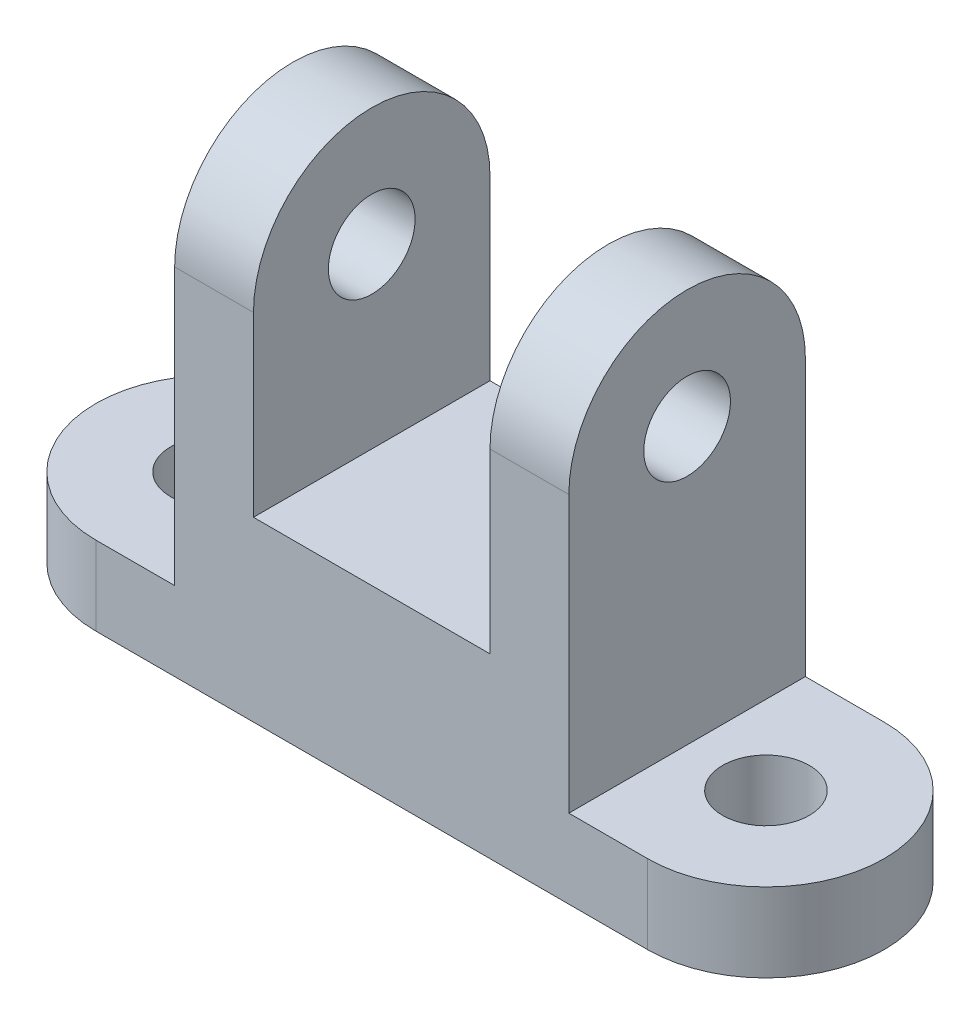
ISO-10303-21;
HEADER;
FILE_DESCRIPTION(('STEP AP214'),'2;1');
FILE_NAME('part.step','',(''),(''),'','','');
FILE_SCHEMA(('AUTOMOTIVE_DESIGN { 1 0 10303 214 1 1 1 1 }'));
ENDSEC;
DATA;
#1=APPLICATION_CONTEXT('core data for automotive mechanical design processes');
#2=APPLICATION_PROTOCOL_DEFINITION('international standard','automotive_design',2000,#1);
#3=PRODUCT_CONTEXT('',#1,'mechanical');
#4=PRODUCT('Part','Part','',(#3));
#5=PRODUCT_RELATED_PRODUCT_CATEGORY('part','',(#4));
#6=PRODUCT_DEFINITION_FORMATION('','',#4);
#7=PRODUCT_DEFINITION_CONTEXT('part definition',#1,'design');
#8=PRODUCT_DEFINITION('design','',#6,#7);
#9=PRODUCT_DEFINITION_SHAPE('','',#8);
#10=(LENGTH_UNIT() NAMED_UNIT(*) SI_UNIT(.MILLI.,.METRE.));
#11=(NAMED_UNIT(*) PLANE_ANGLE_UNIT() SI_UNIT($,.RADIAN.));
#12=(NAMED_UNIT(*) SI_UNIT($,.STERADIAN.) SOLID_ANGLE_UNIT());
#13=UNCERTAINTY_MEASURE_WITH_UNIT(LENGTH_MEASURE(1.E-05),#10,'distance_accuracy_value','');
#14=(GEOMETRIC_REPRESENTATION_CONTEXT(3) GLOBAL_UNCERTAINTY_ASSIGNED_CONTEXT((#13)) GLOBAL_UNIT_ASSIGNED_CONTEXT((#10,
#11,#12)) REPRESENTATION_CONTEXT('',''));
#15=CARTESIAN_POINT('',(0.,0.,0.));
#16=DIRECTION('',(0.,0.,1.));
#17=DIRECTION('',(1.,0.,0.));
#18=AXIS2_PLACEMENT_3D('',#15,#16,#17);
#19=CARTESIAN_POINT('',(-5.,9.,0.));
#20=DIRECTION('',(-1.,0.,0.));
#21=DIRECTION('',(0.,0.,1.));
#22=AXIS2_PLACEMENT_3D('',#19,#20,#21);
#23=CYLINDRICAL_SURFACE('',#22,3.);
#24=CARTESIAN_POINT('',(-3.,9.,0.));
#25=DIRECTION('',(-1.,0.,0.));
#26=DIRECTION('',(0.,-1.,0.));
#27=AXIS2_PLACEMENT_3D('',#24,#25,#26);
#28=CIRCLE('',#27,3.);
#29=CARTESIAN_POINT('',(-3.,9.,-3.));
#30=VERTEX_POINT('',#29);
#31=CARTESIAN_POINT('',(-3.,9.,3.));
#32=VERTEX_POINT('',#31);
#33=EDGE_CURVE('E161',#30,#32,#28,.F.);
#34=ORIENTED_EDGE('',*,*,#33,.F.);
#35=DIRECTION('',(-1.,0.,0.));
#36=VECTOR('',#35,1.);
#37=CARTESIAN_POINT('',(-7.,9.,-3.));
#38=LINE('',#37,#36);
#39=CARTESIAN_POINT('',(-5.,9.,-3.));
#40=VERTEX_POINT('',#39);
#41=EDGE_CURVE('E232',#40,#30,#38,.F.);
#42=ORIENTED_EDGE('',*,*,#41,.F.);
#43=CARTESIAN_POINT('',(-5.,9.,0.));
#44=DIRECTION('',(-1.,0.,0.));
#45=DIRECTION('',(0.,0.,1.));
#46=AXIS2_PLACEMENT_3D('',#43,#44,#45);
#47=CIRCLE('',#46,3.);
#48=CARTESIAN_POINT('',(-5.,9.,3.));
#49=VERTEX_POINT('',#48);
#50=EDGE_CURVE('E48',#49,#40,#47,.T.);
#51=ORIENTED_EDGE('',*,*,#50,.F.);
#52=DIRECTION('',(-1.,0.,0.));
#53=VECTOR('',#52,1.);
#54=CARTESIAN_POINT('',(-7.,9.,3.));
#55=LINE('',#54,#53);
#56=EDGE_CURVE('E64',#32,#49,#55,.T.);
#57=ORIENTED_EDGE('',*,*,#56,.F.);
#58=EDGE_LOOP('',(#34,#42,#51,#57));
#59=FACE_BOUND('',#58,.T.);
#60=ADVANCED_FACE('F38',(#59),#23,.T.);
#61=CARTESIAN_POINT('',(-23.,9.,0.));
#62=DIRECTION('',(1.,0.,0.));
#63=DIRECTION('',(0.,0.,-1.));
#64=AXIS2_PLACEMENT_3D('',#61,#62,#63);
#65=CYLINDRICAL_SURFACE('',#64,1.1);
#66=CARTESIAN_POINT('',(-3.,9.,0.));
#67=DIRECTION('',(-1.,0.,0.));
#68=DIRECTION('',(0.,-1.,0.));
#69=AXIS2_PLACEMENT_3D('',#66,#67,#68);
#70=CIRCLE('',#69,1.1);
#71=CARTESIAN_POINT('',(-3.,7.9,0.));
#72=VERTEX_POINT('',#71);
#73=EDGE_CURVE('E43',#72,#72,#70,.F.);
#74=ORIENTED_EDGE('',*,*,#73,.T.);
#75=EDGE_LOOP('',(#74));
#76=FACE_BOUND('',#75,.T.);
#77=CARTESIAN_POINT('',(-5.,9.,0.));
#78=DIRECTION('',(-1.,0.,0.));
#79=DIRECTION('',(0.,0.,1.));
#80=AXIS2_PLACEMENT_3D('',#77,#78,#79);
#81=CIRCLE('',#80,1.1);
#82=CARTESIAN_POINT('',(-5.,9.,1.1));
#83=VERTEX_POINT('',#82);
#84=EDGE_CURVE('E180',#83,#83,#81,.T.);
#85=ORIENTED_EDGE('',*,*,#84,.T.);
#86=EDGE_LOOP('',(#85));
#87=FACE_BOUND('',#86,.T.);
#88=ADVANCED_FACE('F258',(#76,#87),#65,.F.);
#89=CARTESIAN_POINT('',(3.,9.,0.));
#90=DIRECTION('',(1.,0.,0.));
#91=DIRECTION('',(0.,1.,0.));
#92=AXIS2_PLACEMENT_3D('',#89,#90,#91);
#93=CIRCLE('',#92,3.);
#94=CARTESIAN_POINT('',(3.,9.,3.));
#95=VERTEX_POINT('',#94);
#96=CARTESIAN_POINT('',(3.,9.,-3.));
#97=VERTEX_POINT('',#96);
#98=EDGE_CURVE('E56',#95,#97,#93,.F.);
#99=ORIENTED_EDGE('',*,*,#98,.F.);
#100=CARTESIAN_POINT('',(5.,9.,3.));
#101=VERTEX_POINT('',#100);
#102=EDGE_CURVE('E234',#101,#95,#55,.T.);
#103=ORIENTED_EDGE('',*,*,#102,.F.);
#104=CARTESIAN_POINT('',(5.,9.,0.));
#105=DIRECTION('',(-1.,0.,0.));
#106=DIRECTION('',(0.,0.,1.));
#107=AXIS2_PLACEMENT_3D('',#104,#105,#106);
#108=CIRCLE('',#107,3.);
#109=CARTESIAN_POINT('',(5.,9.,-3.));
#110=VERTEX_POINT('',#109);
#111=EDGE_CURVE('E11',#110,#101,#108,.F.);
#112=ORIENTED_EDGE('',*,*,#111,.F.);
#113=EDGE_CURVE('E231',#97,#110,#38,.F.);
#114=ORIENTED_EDGE('',*,*,#113,.F.);
#115=EDGE_LOOP('',(#99,#103,#112,#114));
#116=FACE_BOUND('',#115,.T.);
#117=ADVANCED_FACE('F41',(#116),#23,.T.);
#118=CARTESIAN_POINT('',(-7.,2.,0.));
#119=DIRECTION('',(0.,1.,0.));
#120=DIRECTION('',(0.,0.,1.));
#121=AXIS2_PLACEMENT_3D('',#118,#119,#120);
#122=PLANE('',#121);
#123=CARTESIAN_POINT('',(7.,2.,0.));
#124=DIRECTION('',(0.,1.,0.));
#125=DIRECTION('',(0.,0.,1.));
#126=AXIS2_PLACEMENT_3D('',#123,#124,#125);
#127=CIRCLE('',#126,1.1);
#128=CARTESIAN_POINT('',(7.,2.,1.1));
#129=VERTEX_POINT('',#128);
#130=EDGE_CURVE('E171',#129,#129,#127,.T.);
#131=ORIENTED_EDGE('',*,*,#130,.F.);
#132=EDGE_LOOP('',(#131));
#133=FACE_BOUND('',#132,.T.);
#134=DIRECTION('',(-1.,0.,0.));
#135=VECTOR('',#134,1.);
#136=CARTESIAN_POINT('',(-7.,2.,-3.));
#137=LINE('',#136,#135);
#138=CARTESIAN_POINT('',(7.,2.,-3.));
#139=VERTEX_POINT('',#138);
#140=CARTESIAN_POINT('',(5.,2.,-3.));
#141=VERTEX_POINT('',#140);
#142=EDGE_CURVE('E210',#139,#141,#137,.T.);
#143=ORIENTED_EDGE('',*,*,#142,.T.);
#144=DIRECTION('',(0.,0.,1.));
#145=VECTOR('',#144,1.);
#146=CARTESIAN_POINT('',(5.,2.,0.));
#147=LINE('',#146,#145);
#148=CARTESIAN_POINT('',(5.,2.,3.));
#149=VERTEX_POINT('',#148);
#150=EDGE_CURVE('E195',#141,#149,#147,.T.);
#151=ORIENTED_EDGE('',*,*,#150,.T.);
#152=DIRECTION('',(1.,0.,0.));
#153=VECTOR('',#152,1.);
#154=CARTESIAN_POINT('',(-7.,2.,3.));
#155=LINE('',#154,#153);
#156=CARTESIAN_POINT('',(7.,2.,3.));
#157=VERTEX_POINT('',#156);
#158=EDGE_CURVE('E202',#149,#157,#155,.T.);
#159=ORIENTED_EDGE('',*,*,#158,.T.);
#160=CARTESIAN_POINT('',(7.,2.,0.));
#161=DIRECTION('',(0.,1.,0.));
#162=DIRECTION('',(0.,0.,1.));
#163=AXIS2_PLACEMENT_3D('',#160,#161,#162);
#164=CIRCLE('',#163,3.);
#165=EDGE_CURVE('E207',#157,#139,#164,.T.);
#166=ORIENTED_EDGE('',*,*,#165,.T.);
#167=EDGE_LOOP('',(#143,#151,#159,#166));
#168=FACE_BOUND('',#167,.T.);
#169=ADVANCED_FACE('F267',(#133,#168),#122,.T.);
#170=CARTESIAN_POINT('',(-7.,2.,0.));
#171=DIRECTION('',(0.,-1.,0.));
#172=DIRECTION('',(0.,0.,-1.));
#173=AXIS2_PLACEMENT_3D('',#170,#171,#172);
#174=CYLINDRICAL_SURFACE('',#173,3.);
#175=CARTESIAN_POINT('',(-7.,0.,0.));
#176=DIRECTION('',(0.,1.,0.));
#177=DIRECTION('',(0.,0.,1.));
#178=AXIS2_PLACEMENT_3D('',#175,#176,#177);
#179=CIRCLE('',#178,3.);
#180=CARTESIAN_POINT('',(-7.,0.,-3.));
#181=VERTEX_POINT('',#180);
#182=CARTESIAN_POINT('',(-7.,0.,3.));
#183=VERTEX_POINT('',#182);
#184=EDGE_CURVE('E198',#181,#183,#179,.T.);
#185=ORIENTED_EDGE('',*,*,#184,.T.);
#186=DIRECTION('',(0.,-1.,0.));
#187=VECTOR('',#186,1.);
#188=CARTESIAN_POINT('',(-7.,2.,3.));
#189=LINE('',#188,#187);
#190=CARTESIAN_POINT('',(-7.,2.,3.));
#191=VERTEX_POINT('',#190);
#192=EDGE_CURVE('E228',#191,#183,#189,.T.);
#193=ORIENTED_EDGE('',*,*,#192,.F.);
#194=CARTESIAN_POINT('',(-7.,2.,0.));
#195=DIRECTION('',(0.,1.,0.));
#196=DIRECTION('',(0.,0.,1.));
#197=AXIS2_PLACEMENT_3D('',#194,#195,#196);
#198=CIRCLE('',#197,3.);
#199=CARTESIAN_POINT('',(-7.,2.,-3.));
#200=VERTEX_POINT('',#199);
#201=EDGE_CURVE('E199',#200,#191,#198,.T.);
#202=ORIENTED_EDGE('',*,*,#201,.F.);
#203=DIRECTION('',(0.,-1.,0.));
#204=VECTOR('',#203,1.);
#205=CARTESIAN_POINT('',(-7.,2.,-3.));
#206=LINE('',#205,#204);
#207=EDGE_CURVE('E212',#200,#181,#206,.T.);
#208=ORIENTED_EDGE('',*,*,#207,.T.);
#209=EDGE_LOOP('',(#185,#193,#202,#208));
#210=FACE_BOUND('',#209,.T.);
#211=ADVANCED_FACE('F272',(#210),#174,.T.);
#212=CARTESIAN_POINT('',(-7.,2.,3.));
#213=DIRECTION('',(0.,0.,-1.));
#214=DIRECTION('',(-1.,0.,0.));
#215=AXIS2_PLACEMENT_3D('',#212,#213,#214);
#216=PLANE('',#215);
#217=DIRECTION('',(-1.,0.,0.));
#218=VECTOR('',#217,1.);
#219=CARTESIAN_POINT('',(-7.,4.5,3.));
#220=LINE('',#219,#218);
#221=CARTESIAN_POINT('',(3.,4.5,3.));
#222=VERTEX_POINT('',#221);
#223=CARTESIAN_POINT('',(-3.,4.5,3.));
#224=VERTEX_POINT('',#223);
#225=EDGE_CURVE('E138',#222,#224,#220,.T.);
#226=ORIENTED_EDGE('',*,*,#225,.T.);
#227=DIRECTION('',(0.,1.,0.));
#228=VECTOR('',#227,1.);
#229=CARTESIAN_POINT('',(-3.,2.,3.));
#230=LINE('',#229,#228);
#231=EDGE_CURVE('E159',#224,#32,#230,.T.);
#232=ORIENTED_EDGE('',*,*,#231,.T.);
#233=ORIENTED_EDGE('',*,*,#56,.T.);
#234=DIRECTION('',(0.,-1.,0.));
#235=VECTOR('',#234,1.);
#236=CARTESIAN_POINT('',(-5.,0.,3.));
#237=LINE('',#236,#235);
#238=CARTESIAN_POINT('',(-5.,2.,3.));
#239=VERTEX_POINT('',#238);
#240=EDGE_CURVE('E189',#49,#239,#237,.T.);
#241=ORIENTED_EDGE('',*,*,#240,.T.);
#242=EDGE_CURVE('E204',#191,#239,#155,.T.);
#243=ORIENTED_EDGE('',*,*,#242,.F.);
#244=ORIENTED_EDGE('',*,*,#192,.T.);
#245=DIRECTION('',(1.,0.,0.));
#246=VECTOR('',#245,1.);
#247=CARTESIAN_POINT('',(-7.,0.,3.));
#248=LINE('',#247,#246);
#249=CARTESIAN_POINT('',(7.,0.,3.));
#250=VERTEX_POINT('',#249);
#251=EDGE_CURVE('E215',#183,#250,#248,.T.);
#252=ORIENTED_EDGE('',*,*,#251,.T.);
#253=DIRECTION('',(0.,-1.,0.));
#254=VECTOR('',#253,1.);
#255=CARTESIAN_POINT('',(7.,2.,3.));
#256=LINE('',#255,#254);
#257=EDGE_CURVE('E225',#157,#250,#256,.T.);
#258=ORIENTED_EDGE('',*,*,#257,.F.);
#259=ORIENTED_EDGE('',*,*,#158,.F.);
#260=DIRECTION('',(0.,-1.,0.));
#261=VECTOR('',#260,1.);
#262=CARTESIAN_POINT('',(5.,0.,3.));
#263=LINE('',#262,#261);
#264=EDGE_CURVE('E182',#101,#149,#263,.T.);
#265=ORIENTED_EDGE('',*,*,#264,.F.);
#266=ORIENTED_EDGE('',*,*,#102,.T.);
#267=DIRECTION('',(0.,-1.,0.));
#268=VECTOR('',#267,1.);
#269=CARTESIAN_POINT('',(3.,2.,3.));
#270=LINE('',#269,#268);
#271=EDGE_CURVE('E156',#95,#222,#270,.T.);
#272=ORIENTED_EDGE('',*,*,#271,.T.);
#273=EDGE_LOOP('',(#226,#232,#233,#241,#243,#244,#252,#258,#259,#265,#266,#272));
#274=FACE_BOUND('',#273,.T.);
#275=ADVANCED_FACE('F279',(#274),#216,.F.);
#276=CARTESIAN_POINT('',(7.,2.,0.));
#277=DIRECTION('',(0.,-1.,0.));
#278=DIRECTION('',(0.,0.,-1.));
#279=AXIS2_PLACEMENT_3D('',#276,#277,#278);
#280=CYLINDRICAL_SURFACE('',#279,3.);
#281=CARTESIAN_POINT('',(7.,0.,0.));
#282=DIRECTION('',(0.,1.,0.));
#283=DIRECTION('',(0.,0.,1.));
#284=AXIS2_PLACEMENT_3D('',#281,#282,#283);
#285=CIRCLE('',#284,3.);
#286=CARTESIAN_POINT('',(7.,0.,-3.));
#287=VERTEX_POINT('',#286);
#288=EDGE_CURVE('E217',#250,#287,#285,.T.);
#289=ORIENTED_EDGE('',*,*,#288,.T.);
#290=DIRECTION('',(0.,-1.,0.));
#291=VECTOR('',#290,1.);
#292=CARTESIAN_POINT('',(7.,2.,-3.));
#293=LINE('',#292,#291);
#294=EDGE_CURVE('E222',#139,#287,#293,.T.);
#295=ORIENTED_EDGE('',*,*,#294,.F.);
#296=ORIENTED_EDGE('',*,*,#165,.F.);
#297=ORIENTED_EDGE('',*,*,#257,.T.);
#298=EDGE_LOOP('',(#289,#295,#296,#297));
#299=FACE_BOUND('',#298,.T.);
#300=ADVANCED_FACE('F330',(#299),#280,.T.);
#301=CARTESIAN_POINT('',(-7.,2.,-3.));
#302=DIRECTION('',(0.,0.,1.));
#303=DIRECTION('',(1.,0.,0.));
#304=AXIS2_PLACEMENT_3D('',#301,#302,#303);
#305=PLANE('',#304);
#306=ORIENTED_EDGE('',*,*,#41,.T.);
#307=DIRECTION('',(0.,1.,0.));
#308=VECTOR('',#307,1.);
#309=CARTESIAN_POINT('',(-3.,13.7058288155448,-3.));
#310=LINE('',#309,#308);
#311=CARTESIAN_POINT('',(-3.,4.5,-3.));
#312=VERTEX_POINT('',#311);
#313=EDGE_CURVE('E147',#312,#30,#310,.T.);
#314=ORIENTED_EDGE('',*,*,#313,.F.);
#315=DIRECTION('',(-1.,0.,0.));
#316=VECTOR('',#315,1.);
#317=CARTESIAN_POINT('',(3.,4.5,-3.));
#318=LINE('',#317,#316);
#319=CARTESIAN_POINT('',(3.,4.5,-3.));
#320=VERTEX_POINT('',#319);
#321=EDGE_CURVE('E135',#320,#312,#318,.T.);
#322=ORIENTED_EDGE('',*,*,#321,.F.);
#323=DIRECTION('',(0.,-1.,0.));
#324=VECTOR('',#323,1.);
#325=CARTESIAN_POINT('',(3.,13.7058288155448,-3.));
#326=LINE('',#325,#324);
#327=EDGE_CURVE('E142',#97,#320,#326,.T.);
#328=ORIENTED_EDGE('',*,*,#327,.F.);
#329=ORIENTED_EDGE('',*,*,#113,.T.);
#330=DIRECTION('',(0.,1.,0.));
#331=VECTOR('',#330,1.);
#332=CARTESIAN_POINT('',(5.,0.,-3.));
#333=LINE('',#332,#331);
#334=EDGE_CURVE('E184',#141,#110,#333,.T.);
#335=ORIENTED_EDGE('',*,*,#334,.F.);
#336=ORIENTED_EDGE('',*,*,#142,.F.);
#337=ORIENTED_EDGE('',*,*,#294,.T.);
#338=DIRECTION('',(-1.,0.,0.));
#339=VECTOR('',#338,1.);
#340=CARTESIAN_POINT('',(-7.,0.,-3.));
#341=LINE('',#340,#339);
#342=EDGE_CURVE('E203',#287,#181,#341,.T.);
#343=ORIENTED_EDGE('',*,*,#342,.T.);
#344=ORIENTED_EDGE('',*,*,#207,.F.);
#345=CARTESIAN_POINT('',(-5.,2.,-3.));
#346=VERTEX_POINT('',#345);
#347=EDGE_CURVE('E209',#346,#200,#137,.T.);
#348=ORIENTED_EDGE('',*,*,#347,.F.);
#349=DIRECTION('',(0.,1.,0.));
#350=VECTOR('',#349,1.);
#351=CARTESIAN_POINT('',(-5.,0.,-3.));
#352=LINE('',#351,#350);
#353=EDGE_CURVE('E185',#346,#40,#352,.T.);
#354=ORIENTED_EDGE('',*,*,#353,.T.);
#355=EDGE_LOOP('',(#306,#314,#322,#328,#329,#335,#336,#337,#343,#344,#348,#354));
#356=FACE_BOUND('',#355,.T.);
#357=ADVANCED_FACE('F150',(#356),#305,.F.);
#358=CARTESIAN_POINT('',(-7.,2.,0.));
#359=DIRECTION('',(0.,1.,0.));
#360=DIRECTION('',(0.,0.,1.));
#361=AXIS2_PLACEMENT_3D('',#358,#359,#360);
#362=CIRCLE('',#361,1.1);
#363=CARTESIAN_POINT('',(-7.,2.,1.1));
#364=VERTEX_POINT('',#363);
#365=EDGE_CURVE('E168',#364,#364,#362,.T.);
#366=ORIENTED_EDGE('',*,*,#365,.F.);
#367=EDGE_LOOP('',(#366));
#368=FACE_BOUND('',#367,.T.);
#369=DIRECTION('',(0.,0.,1.));
#370=VECTOR('',#369,1.);
#371=CARTESIAN_POINT('',(-5.,2.,0.));
#372=LINE('',#371,#370);
#373=EDGE_CURVE('E188',#346,#239,#372,.T.);
#374=ORIENTED_EDGE('',*,*,#373,.F.);
#375=ORIENTED_EDGE('',*,*,#347,.T.);
#376=ORIENTED_EDGE('',*,*,#201,.T.);
#377=ORIENTED_EDGE('',*,*,#242,.T.);
#378=EDGE_LOOP('',(#374,#375,#376,#377));
#379=FACE_BOUND('',#378,.T.);
#380=ADVANCED_FACE('F275',(#368,#379),#122,.T.);
#381=CARTESIAN_POINT('',(-7.,0.,0.));
#382=DIRECTION('',(0.,1.,0.));
#383=DIRECTION('',(0.,0.,1.));
#384=AXIS2_PLACEMENT_3D('',#381,#382,#383);
#385=PLANE('',#384);
#386=CARTESIAN_POINT('',(0.,0.,0.));
#387=DIRECTION('',(0.,-1.,0.));
#388=DIRECTION('',(0.,0.,-1.));
#389=AXIS2_PLACEMENT_3D('',#386,#387,#388);
#390=CIRCLE('',#389,1.5);
#391=CARTESIAN_POINT('',(0.,0.,-1.5));
#392=VERTEX_POINT('',#391);
#393=EDGE_CURVE('E164',#392,#392,#390,.T.);
#394=ORIENTED_EDGE('',*,*,#393,.F.);
#395=EDGE_LOOP('',(#394));
#396=FACE_BOUND('',#395,.T.);
#397=CARTESIAN_POINT('',(7.,0.,0.));
#398=DIRECTION('',(0.,1.,0.));
#399=DIRECTION('',(0.,0.,1.));
#400=AXIS2_PLACEMENT_3D('',#397,#398,#399);
#401=CIRCLE('',#400,1.1);
#402=CARTESIAN_POINT('',(7.,0.,1.1));
#403=VERTEX_POINT('',#402);
#404=EDGE_CURVE('E181',#403,#403,#401,.T.);
#405=ORIENTED_EDGE('',*,*,#404,.T.);
#406=EDGE_LOOP('',(#405));
#407=FACE_BOUND('',#406,.T.);
#408=CARTESIAN_POINT('',(-7.,0.,0.));
#409=DIRECTION('',(0.,1.,0.));
#410=DIRECTION('',(0.,0.,1.));
#411=AXIS2_PLACEMENT_3D('',#408,#409,#410);
#412=CIRCLE('',#411,1.1);
#413=CARTESIAN_POINT('',(-7.,0.,1.1));
#414=VERTEX_POINT('',#413);
#415=EDGE_CURVE('E174',#414,#414,#412,.T.);
#416=ORIENTED_EDGE('',*,*,#415,.T.);
#417=EDGE_LOOP('',(#416));
#418=FACE_BOUND('',#417,.T.);
#419=ORIENTED_EDGE('',*,*,#184,.F.);
#420=ORIENTED_EDGE('',*,*,#342,.F.);
#421=ORIENTED_EDGE('',*,*,#288,.F.);
#422=ORIENTED_EDGE('',*,*,#251,.F.);
#423=EDGE_LOOP('',(#419,#420,#421,#422));
#424=FACE_BOUND('',#423,.T.);
#425=ADVANCED_FACE('F296',(#396,#407,#418,#424),#385,.F.);
#426=CARTESIAN_POINT('',(5.,0.,0.));
#427=DIRECTION('',(-1.,0.,0.));
#428=DIRECTION('',(0.,0.,1.));
#429=AXIS2_PLACEMENT_3D('',#426,#427,#428);
#430=PLANE('',#429);
#431=CARTESIAN_POINT('',(5.,9.,0.));
#432=DIRECTION('',(1.,0.,0.));
#433=DIRECTION('',(0.,0.,-1.));
#434=AXIS2_PLACEMENT_3D('',#431,#432,#433);
#435=CIRCLE('',#434,1.1);
#436=CARTESIAN_POINT('',(5.,9.,-1.1));
#437=VERTEX_POINT('',#436);
#438=EDGE_CURVE('E177',#437,#437,#435,.T.);
#439=ORIENTED_EDGE('',*,*,#438,.F.);
#440=EDGE_LOOP('',(#439));
#441=FACE_BOUND('',#440,.T.);
#442=ORIENTED_EDGE('',*,*,#334,.T.);
#443=ORIENTED_EDGE('',*,*,#111,.T.);
#444=ORIENTED_EDGE('',*,*,#264,.T.);
#445=ORIENTED_EDGE('',*,*,#150,.F.);
#446=EDGE_LOOP('',(#442,#443,#444,#445));
#447=FACE_BOUND('',#446,.T.);
#448=ADVANCED_FACE('F284',(#441,#447),#430,.F.);
#449=CARTESIAN_POINT('',(-5.,0.,0.));
#450=DIRECTION('',(-1.,0.,0.));
#451=DIRECTION('',(0.,0.,1.));
#452=AXIS2_PLACEMENT_3D('',#449,#450,#451);
#453=PLANE('',#452);
#454=ORIENTED_EDGE('',*,*,#84,.F.);
#455=EDGE_LOOP('',(#454));
#456=FACE_BOUND('',#455,.T.);
#457=ORIENTED_EDGE('',*,*,#240,.F.);
#458=ORIENTED_EDGE('',*,*,#50,.T.);
#459=ORIENTED_EDGE('',*,*,#353,.F.);
#460=ORIENTED_EDGE('',*,*,#373,.T.);
#461=EDGE_LOOP('',(#457,#458,#459,#460));
#462=FACE_BOUND('',#461,.T.);
#463=ADVANCED_FACE('F305',(#456,#462),#453,.T.);
#464=CARTESIAN_POINT('',(3.,9.,0.));
#465=DIRECTION('',(1.,0.,0.));
#466=DIRECTION('',(0.,1.,0.));
#467=AXIS2_PLACEMENT_3D('',#464,#465,#466);
#468=CIRCLE('',#467,1.1);
#469=CARTESIAN_POINT('',(3.,10.1,0.));
#470=VERTEX_POINT('',#469);
#471=EDGE_CURVE('E154',#470,#470,#468,.F.);
#472=ORIENTED_EDGE('',*,*,#471,.T.);
#473=EDGE_LOOP('',(#472));
#474=FACE_BOUND('',#473,.T.);
#475=ORIENTED_EDGE('',*,*,#438,.T.);
#476=EDGE_LOOP('',(#475));
#477=FACE_BOUND('',#476,.T.);
#478=ADVANCED_FACE('F246',(#474,#477),#65,.F.);
#479=CARTESIAN_POINT('',(-7.,-1.5,0.));
#480=DIRECTION('',(0.,1.,0.));
#481=DIRECTION('',(0.,0.,1.));
#482=AXIS2_PLACEMENT_3D('',#479,#480,#481);
#483=CYLINDRICAL_SURFACE('',#482,1.1);
#484=ORIENTED_EDGE('',*,*,#365,.T.);
#485=EDGE_LOOP('',(#484));
#486=FACE_BOUND('',#485,.T.);
#487=ORIENTED_EDGE('',*,*,#415,.F.);
#488=EDGE_LOOP('',(#487));
#489=FACE_BOUND('',#488,.T.);
#490=ADVANCED_FACE('F319',(#486,#489),#483,.F.);
#491=CARTESIAN_POINT('',(7.,-1.5,0.));
#492=DIRECTION('',(0.,1.,0.));
#493=DIRECTION('',(0.,0.,1.));
#494=AXIS2_PLACEMENT_3D('',#491,#492,#493);
#495=CYLINDRICAL_SURFACE('',#494,1.1);
#496=ORIENTED_EDGE('',*,*,#130,.T.);
#497=EDGE_LOOP('',(#496));
#498=FACE_BOUND('',#497,.T.);
#499=ORIENTED_EDGE('',*,*,#404,.F.);
#500=EDGE_LOOP('',(#499));
#501=FACE_BOUND('',#500,.T.);
#502=ADVANCED_FACE('F412',(#498,#501),#495,.F.);
#503=CARTESIAN_POINT('',(0.,0.1,0.));
#504=DIRECTION('',(0.,-1.,0.));
#505=DIRECTION('',(0.,0.,-1.));
#506=AXIS2_PLACEMENT_3D('',#503,#504,#505);
#507=CYLINDRICAL_SURFACE('',#506,1.5);
#508=CARTESIAN_POINT('',(0.,0.1,0.));
#509=DIRECTION('',(0.,-1.,0.));
#510=DIRECTION('',(0.,0.,-1.));
#511=AXIS2_PLACEMENT_3D('',#508,#509,#510);
#512=CIRCLE('',#511,1.5);
#513=CARTESIAN_POINT('',(0.,0.1,-1.5));
#514=VERTEX_POINT('',#513);
#515=EDGE_CURVE('E165',#514,#514,#512,.T.);
#516=ORIENTED_EDGE('',*,*,#515,.F.);
#517=EDGE_LOOP('',(#516));
#518=FACE_BOUND('',#517,.T.);
#519=ORIENTED_EDGE('',*,*,#393,.T.);
#520=EDGE_LOOP('',(#519));
#521=FACE_BOUND('',#520,.T.);
#522=ADVANCED_FACE('F420',(#518,#521),#507,.F.);
#523=CARTESIAN_POINT('',(0.,0.1,0.));
#524=DIRECTION('',(0.,-1.,0.));
#525=DIRECTION('',(0.,0.,-1.));
#526=AXIS2_PLACEMENT_3D('',#523,#524,#525);
#527=PLANE('',#526);
#528=ORIENTED_EDGE('',*,*,#515,.T.);
#529=EDGE_LOOP('',(#528));
#530=FACE_BOUND('',#529,.T.);
#531=ADVANCED_FACE('F428',(#530),#527,.T.);
#532=CARTESIAN_POINT('',(3.,4.5,7.));
#533=DIRECTION('',(0.,-1.,0.));
#534=DIRECTION('',(0.,0.,-1.));
#535=AXIS2_PLACEMENT_3D('',#532,#533,#534);
#536=PLANE('',#535);
#537=DIRECTION('',(0.,0.,-1.));
#538=VECTOR('',#537,1.);
#539=CARTESIAN_POINT('',(3.,4.5,7.));
#540=LINE('',#539,#538);
#541=EDGE_CURVE('E131',#222,#320,#540,.T.);
#542=ORIENTED_EDGE('',*,*,#541,.T.);
#543=ORIENTED_EDGE('',*,*,#321,.T.);
#544=DIRECTION('',(0.,0.,-1.));
#545=VECTOR('',#544,1.);
#546=CARTESIAN_POINT('',(-3.,4.5,7.));
#547=LINE('',#546,#545);
#548=EDGE_CURVE('E140',#224,#312,#547,.T.);
#549=ORIENTED_EDGE('',*,*,#548,.F.);
#550=ORIENTED_EDGE('',*,*,#225,.F.);
#551=EDGE_LOOP('',(#542,#543,#549,#550));
#552=FACE_BOUND('',#551,.T.);
#553=ADVANCED_FACE('F132',(#552),#536,.F.);
#554=CARTESIAN_POINT('',(-3.,13.7058288155448,7.));
#555=DIRECTION('',(-1.,0.,0.));
#556=DIRECTION('',(0.,-1.,0.));
#557=AXIS2_PLACEMENT_3D('',#554,#555,#556);
#558=PLANE('',#557);
#559=ORIENTED_EDGE('',*,*,#33,.T.);
#560=ORIENTED_EDGE('',*,*,#231,.F.);
#561=ORIENTED_EDGE('',*,*,#548,.T.);
#562=ORIENTED_EDGE('',*,*,#313,.T.);
#563=EDGE_LOOP('',(#559,#560,#561,#562));
#564=FACE_BOUND('',#563,.T.);
#565=ORIENTED_EDGE('',*,*,#73,.F.);
#566=EDGE_LOOP('',(#565));
#567=FACE_BOUND('',#566,.T.);
#568=ADVANCED_FACE('F249',(#564,#567),#558,.F.);
#569=CARTESIAN_POINT('',(3.,13.7058288155448,7.));
#570=DIRECTION('',(1.,0.,0.));
#571=DIRECTION('',(0.,1.,0.));
#572=AXIS2_PLACEMENT_3D('',#569,#570,#571);
#573=PLANE('',#572);
#574=ORIENTED_EDGE('',*,*,#98,.T.);
#575=ORIENTED_EDGE('',*,*,#327,.T.);
#576=ORIENTED_EDGE('',*,*,#541,.F.);
#577=ORIENTED_EDGE('',*,*,#271,.F.);
#578=EDGE_LOOP('',(#574,#575,#576,#577));
#579=FACE_BOUND('',#578,.T.);
#580=ORIENTED_EDGE('',*,*,#471,.F.);
#581=EDGE_LOOP('',(#580));
#582=FACE_BOUND('',#581,.T.);
#583=ADVANCED_FACE('F143',(#579,#582),#573,.F.);
#584=CLOSED_SHELL('',(#60,#88,#117,#169,#211,#275,#300,#357,#380,#425,#448,#463,#478,#490,#502,
#522,#531,#553,#568,#583));
#585=MANIFOLD_SOLID_BREP('B2',#584);
#586=ADVANCED_BREP_SHAPE_REPRESENTATION('',(#18,#585),#14);
#587=SHAPE_DEFINITION_REPRESENTATION(#9,#586);
ENDSEC;
END-ISO-10303-21;
